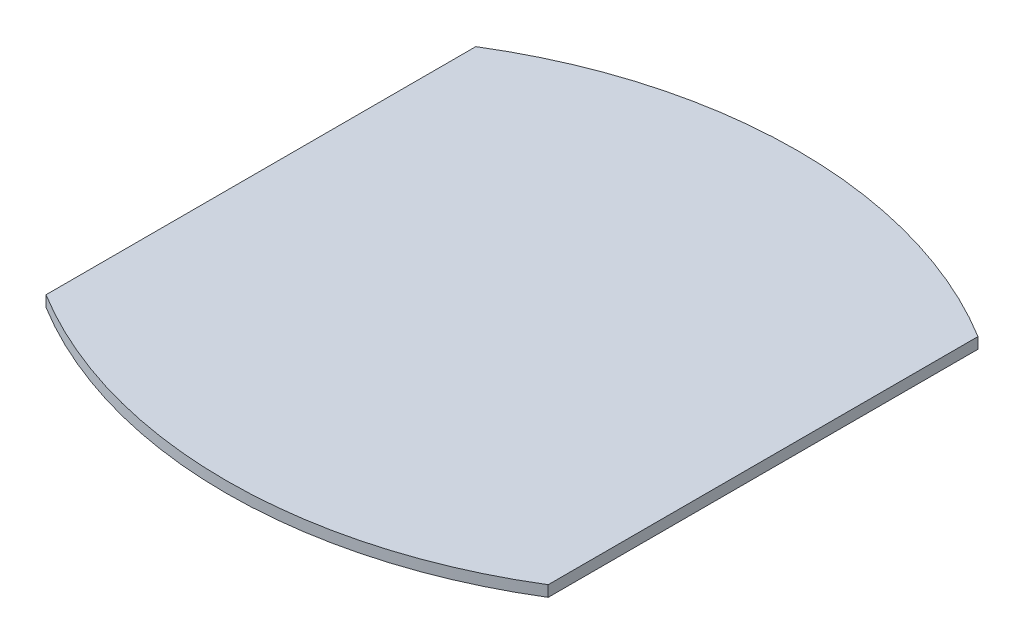
ISO-10303-21;
HEADER;
FILE_DESCRIPTION(('STEP AP214'),'2;1');
FILE_NAME('part.step','',(''),(''),'','','');
FILE_SCHEMA(('AUTOMOTIVE_DESIGN { 1 0 10303 214 1 1 1 1 }'));
ENDSEC;
DATA;
#1=APPLICATION_CONTEXT('core data for automotive mechanical design processes');
#2=APPLICATION_PROTOCOL_DEFINITION('international standard','automotive_design',2000,#1);
#3=PRODUCT_CONTEXT('',#1,'mechanical');
#4=PRODUCT('Part','Part','',(#3));
#5=PRODUCT_RELATED_PRODUCT_CATEGORY('part','',(#4));
#6=PRODUCT_DEFINITION_FORMATION('','',#4);
#7=PRODUCT_DEFINITION_CONTEXT('part definition',#1,'design');
#8=PRODUCT_DEFINITION('design','',#6,#7);
#9=PRODUCT_DEFINITION_SHAPE('','',#8);
#10=(LENGTH_UNIT() NAMED_UNIT(*) SI_UNIT(.MILLI.,.METRE.));
#11=(NAMED_UNIT(*) PLANE_ANGLE_UNIT() SI_UNIT($,.RADIAN.));
#12=(NAMED_UNIT(*) SI_UNIT($,.STERADIAN.) SOLID_ANGLE_UNIT());
#13=UNCERTAINTY_MEASURE_WITH_UNIT(LENGTH_MEASURE(1.E-05),#10,'distance_accuracy_value','');
#14=(GEOMETRIC_REPRESENTATION_CONTEXT(3) GLOBAL_UNCERTAINTY_ASSIGNED_CONTEXT((#13)) GLOBAL_UNIT_ASSIGNED_CONTEXT((#10,
#11,#12)) REPRESENTATION_CONTEXT('',''));
#15=CARTESIAN_POINT('',(0.,0.,0.));
#16=DIRECTION('',(0.,0.,1.));
#17=DIRECTION('',(1.,0.,0.));
#18=AXIS2_PLACEMENT_3D('',#15,#16,#17);
#19=CARTESIAN_POINT('',(-145.,6.35,0.));
#20=DIRECTION('',(-1.,0.,0.));
#21=DIRECTION('',(0.,0.,1.));
#22=AXIS2_PLACEMENT_3D('',#19,#20,#21);
#23=PLANE('',#22);
#24=DIRECTION('',(0.,0.,-1.));
#25=VECTOR('',#24,1.);
#26=CARTESIAN_POINT('',(-145.,0.,0.));
#27=LINE('',#26,#25);
#28=CARTESIAN_POINT('',(-145.,0.,124.103571401617));
#29=VERTEX_POINT('',#28);
#30=CARTESIAN_POINT('',(-145.,0.,-124.103571401617));
#31=VERTEX_POINT('',#30);
#32=EDGE_CURVE('E98',#29,#31,#27,.T.);
#33=ORIENTED_EDGE('',*,*,#32,.F.);
#34=DIRECTION('',(0.,-1.,0.));
#35=VECTOR('',#34,1.);
#36=CARTESIAN_POINT('',(-145.,6.35,124.103571401617));
#37=LINE('',#36,#35);
#38=CARTESIAN_POINT('',(-145.,6.35,124.103571401617));
#39=VERTEX_POINT('',#38);
#40=EDGE_CURVE('E11',#39,#29,#37,.T.);
#41=ORIENTED_EDGE('',*,*,#40,.F.);
#42=DIRECTION('',(0.,0.,-1.));
#43=VECTOR('',#42,1.);
#44=CARTESIAN_POINT('',(-145.,6.35,0.));
#45=LINE('',#44,#43);
#46=CARTESIAN_POINT('',(-145.,6.35,-124.103571401617));
#47=VERTEX_POINT('',#46);
#48=EDGE_CURVE('E83',#39,#47,#45,.T.);
#49=ORIENTED_EDGE('',*,*,#48,.T.);
#50=DIRECTION('',(0.,-1.,0.));
#51=VECTOR('',#50,1.);
#52=CARTESIAN_POINT('',(-145.,6.35,-124.103571401617));
#53=LINE('',#52,#51);
#54=EDGE_CURVE('E51',#47,#31,#53,.T.);
#55=ORIENTED_EDGE('',*,*,#54,.T.);
#56=EDGE_LOOP('',(#33,#41,#49,#55));
#57=FACE_BOUND('',#56,.T.);
#58=ADVANCED_FACE('F35',(#57),#23,.T.);
#59=CARTESIAN_POINT('',(0.,6.35,-112.5));
#60=DIRECTION('',(0.,-1.,0.));
#61=DIRECTION('',(0.,0.,-1.));
#62=AXIS2_PLACEMENT_3D('',#59,#60,#61);
#63=CYLINDRICAL_SURFACE('',#62,277.5);
#64=CARTESIAN_POINT('',(0.,0.,-112.5));
#65=DIRECTION('',(0.,1.,0.));
#66=DIRECTION('',(0.,0.,1.));
#67=AXIS2_PLACEMENT_3D('',#64,#65,#66);
#68=CIRCLE('',#67,277.5);
#69=CARTESIAN_POINT('',(145.,0.,124.103571401617));
#70=VERTEX_POINT('',#69);
#71=EDGE_CURVE('E89',#29,#70,#68,.T.);
#72=ORIENTED_EDGE('',*,*,#71,.T.);
#73=DIRECTION('',(0.,-1.,0.));
#74=VECTOR('',#73,1.);
#75=CARTESIAN_POINT('',(145.,6.35,124.103571401617));
#76=LINE('',#75,#74);
#77=CARTESIAN_POINT('',(145.,6.35,124.103571401617));
#78=VERTEX_POINT('',#77);
#79=EDGE_CURVE('E43',#78,#70,#76,.T.);
#80=ORIENTED_EDGE('',*,*,#79,.F.);
#81=CARTESIAN_POINT('',(0.,6.35,-112.5));
#82=DIRECTION('',(0.,1.,0.));
#83=DIRECTION('',(0.,0.,1.));
#84=AXIS2_PLACEMENT_3D('',#81,#82,#83);
#85=CIRCLE('',#84,277.5);
#86=EDGE_CURVE('E77',#39,#78,#85,.T.);
#87=ORIENTED_EDGE('',*,*,#86,.F.);
#88=ORIENTED_EDGE('',*,*,#40,.T.);
#89=EDGE_LOOP('',(#72,#80,#87,#88));
#90=FACE_BOUND('',#89,.T.);
#91=ADVANCED_FACE('F87',(#90),#63,.T.);
#92=CARTESIAN_POINT('',(145.,6.35,0.));
#93=DIRECTION('',(-1.,0.,0.));
#94=DIRECTION('',(0.,0.,1.));
#95=AXIS2_PLACEMENT_3D('',#92,#93,#94);
#96=PLANE('',#95);
#97=DIRECTION('',(0.,0.,-1.));
#98=VECTOR('',#97,1.);
#99=CARTESIAN_POINT('',(145.,0.,0.));
#100=LINE('',#99,#98);
#101=CARTESIAN_POINT('',(145.,0.,-124.103571401617));
#102=VERTEX_POINT('',#101);
#103=EDGE_CURVE('E101',#70,#102,#100,.T.);
#104=ORIENTED_EDGE('',*,*,#103,.T.);
#105=DIRECTION('',(0.,-1.,0.));
#106=VECTOR('',#105,1.);
#107=CARTESIAN_POINT('',(145.,6.35,-124.103571401617));
#108=LINE('',#107,#106);
#109=CARTESIAN_POINT('',(145.,6.35,-124.103571401617));
#110=VERTEX_POINT('',#109);
#111=EDGE_CURVE('E65',#110,#102,#108,.T.);
#112=ORIENTED_EDGE('',*,*,#111,.F.);
#113=DIRECTION('',(0.,0.,-1.));
#114=VECTOR('',#113,1.);
#115=CARTESIAN_POINT('',(145.,6.35,0.));
#116=LINE('',#115,#114);
#117=EDGE_CURVE('E82',#78,#110,#116,.T.);
#118=ORIENTED_EDGE('',*,*,#117,.F.);
#119=ORIENTED_EDGE('',*,*,#79,.T.);
#120=EDGE_LOOP('',(#104,#112,#118,#119));
#121=FACE_BOUND('',#120,.T.);
#122=ADVANCED_FACE('F92',(#121),#96,.F.);
#123=CARTESIAN_POINT('',(0.,6.35,112.5));
#124=DIRECTION('',(0.,-1.,0.));
#125=DIRECTION('',(0.,0.,-1.));
#126=AXIS2_PLACEMENT_3D('',#123,#124,#125);
#127=CYLINDRICAL_SURFACE('',#126,277.5);
#128=CARTESIAN_POINT('',(0.,0.,112.5));
#129=DIRECTION('',(0.,1.,0.));
#130=DIRECTION('',(0.,0.,1.));
#131=AXIS2_PLACEMENT_3D('',#128,#129,#130);
#132=CIRCLE('',#131,277.5);
#133=EDGE_CURVE('E103',#31,#102,#132,.F.);
#134=ORIENTED_EDGE('',*,*,#133,.F.);
#135=ORIENTED_EDGE('',*,*,#54,.F.);
#136=CARTESIAN_POINT('',(0.,6.35,112.5));
#137=DIRECTION('',(0.,1.,0.));
#138=DIRECTION('',(0.,0.,1.));
#139=AXIS2_PLACEMENT_3D('',#136,#137,#138);
#140=CIRCLE('',#139,277.5);
#141=EDGE_CURVE('E93',#47,#110,#140,.F.);
#142=ORIENTED_EDGE('',*,*,#141,.T.);
#143=ORIENTED_EDGE('',*,*,#111,.T.);
#144=EDGE_LOOP('',(#134,#135,#142,#143));
#145=FACE_BOUND('',#144,.T.);
#146=ADVANCED_FACE('F108',(#145),#127,.T.);
#147=CARTESIAN_POINT('',(0.,6.35,0.));
#148=DIRECTION('',(0.,1.,0.));
#149=DIRECTION('',(0.,0.,1.));
#150=AXIS2_PLACEMENT_3D('',#147,#148,#149);
#151=PLANE('',#150);
#152=ORIENTED_EDGE('',*,*,#48,.F.);
#153=ORIENTED_EDGE('',*,*,#86,.T.);
#154=ORIENTED_EDGE('',*,*,#117,.T.);
#155=ORIENTED_EDGE('',*,*,#141,.F.);
#156=EDGE_LOOP('',(#152,#153,#154,#155));
#157=FACE_BOUND('',#156,.T.);
#158=ADVANCED_FACE('F79',(#157),#151,.T.);
#159=CARTESIAN_POINT('',(0.,0.,0.));
#160=DIRECTION('',(0.,1.,0.));
#161=DIRECTION('',(0.,0.,1.));
#162=AXIS2_PLACEMENT_3D('',#159,#160,#161);
#163=PLANE('',#162);
#164=ORIENTED_EDGE('',*,*,#32,.T.);
#165=ORIENTED_EDGE('',*,*,#133,.T.);
#166=ORIENTED_EDGE('',*,*,#103,.F.);
#167=ORIENTED_EDGE('',*,*,#71,.F.);
#168=EDGE_LOOP('',(#164,#165,#166,#167));
#169=FACE_BOUND('',#168,.T.);
#170=ADVANCED_FACE('F115',(#169),#163,.F.);
#171=CLOSED_SHELL('',(#58,#91,#122,#146,#158,#170));
#172=MANIFOLD_SOLID_BREP('B2',#171);
#173=ADVANCED_BREP_SHAPE_REPRESENTATION('',(#18,#172),#14);
#174=SHAPE_DEFINITION_REPRESENTATION(#9,#173);
ENDSEC;
END-ISO-10303-21;
